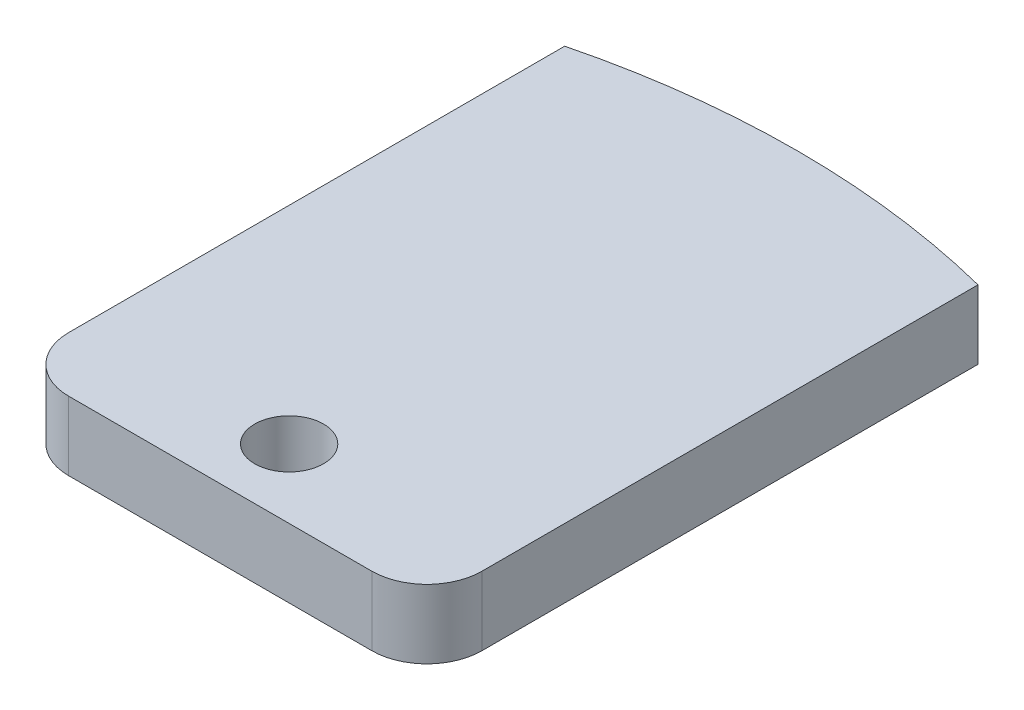
ISO-10303-21;
HEADER;
FILE_DESCRIPTION(('STEP AP214'),'2;1');
FILE_NAME('part.step','',(''),(''),'','','');
FILE_SCHEMA(('AUTOMOTIVE_DESIGN { 1 0 10303 214 1 1 1 1 }'));
ENDSEC;
DATA;
#1=APPLICATION_CONTEXT('core data for automotive mechanical design processes');
#2=APPLICATION_PROTOCOL_DEFINITION('international standard','automotive_design',2000,#1);
#3=PRODUCT_CONTEXT('',#1,'mechanical');
#4=PRODUCT('Part','Part','',(#3));
#5=PRODUCT_RELATED_PRODUCT_CATEGORY('part','',(#4));
#6=PRODUCT_DEFINITION_FORMATION('','',#4);
#7=PRODUCT_DEFINITION_CONTEXT('part definition',#1,'design');
#8=PRODUCT_DEFINITION('design','',#6,#7);
#9=PRODUCT_DEFINITION_SHAPE('','',#8);
#10=(LENGTH_UNIT() NAMED_UNIT(*) SI_UNIT(.MILLI.,.METRE.));
#11=(NAMED_UNIT(*) PLANE_ANGLE_UNIT() SI_UNIT($,.RADIAN.));
#12=(NAMED_UNIT(*) SI_UNIT($,.STERADIAN.) SOLID_ANGLE_UNIT());
#13=UNCERTAINTY_MEASURE_WITH_UNIT(LENGTH_MEASURE(1.E-05),#10,'distance_accuracy_value','');
#14=(GEOMETRIC_REPRESENTATION_CONTEXT(3) GLOBAL_UNCERTAINTY_ASSIGNED_CONTEXT((#13)) GLOBAL_UNIT_ASSIGNED_CONTEXT((#10,
#11,#12)) REPRESENTATION_CONTEXT('',''));
#15=CARTESIAN_POINT('',(0.,0.,0.));
#16=DIRECTION('',(0.,0.,1.));
#17=DIRECTION('',(1.,0.,0.));
#18=AXIS2_PLACEMENT_3D('',#15,#16,#17);
#19=CARTESIAN_POINT('',(-13.97,3.175,20.32));
#20=DIRECTION('',(0.,-1.,0.));
#21=DIRECTION('',(0.,0.,-1.));
#22=AXIS2_PLACEMENT_3D('',#19,#20,#21);
#23=CYLINDRICAL_SURFACE('',#22,5.08);
#24=CARTESIAN_POINT('',(-13.97,-3.175,20.32));
#25=DIRECTION('',(0.,1.,0.));
#26=DIRECTION('',(0.,0.,1.));
#27=AXIS2_PLACEMENT_3D('',#24,#25,#26);
#28=CIRCLE('',#27,5.08);
#29=CARTESIAN_POINT('',(-13.97,-3.175,25.4));
#30=VERTEX_POINT('',#29);
#31=CARTESIAN_POINT('',(-19.05,-3.175,20.32));
#32=VERTEX_POINT('',#31);
#33=EDGE_CURVE('E143',#30,#32,#28,.F.);
#34=ORIENTED_EDGE('',*,*,#33,.F.);
#35=DIRECTION('',(0.,-1.,0.));
#36=VECTOR('',#35,1.);
#37=CARTESIAN_POINT('',(-13.97,3.175,25.4));
#38=LINE('',#37,#36);
#39=CARTESIAN_POINT('',(-13.97,3.175,25.4));
#40=VERTEX_POINT('',#39);
#41=EDGE_CURVE('E11',#40,#30,#38,.T.);
#42=ORIENTED_EDGE('',*,*,#41,.F.);
#43=CARTESIAN_POINT('',(-13.97,3.175,20.32));
#44=DIRECTION('',(0.,1.,0.));
#45=DIRECTION('',(0.,0.,1.));
#46=AXIS2_PLACEMENT_3D('',#43,#44,#45);
#47=CIRCLE('',#46,5.08);
#48=CARTESIAN_POINT('',(-19.05,3.175,20.32));
#49=VERTEX_POINT('',#48);
#50=EDGE_CURVE('E198',#40,#49,#47,.F.);
#51=ORIENTED_EDGE('',*,*,#50,.T.);
#52=DIRECTION('',(0.,-1.,0.));
#53=VECTOR('',#52,1.);
#54=CARTESIAN_POINT('',(-19.05,3.175,20.32));
#55=LINE('',#54,#53);
#56=EDGE_CURVE('E59',#49,#32,#55,.T.);
#57=ORIENTED_EDGE('',*,*,#56,.T.);
#58=EDGE_LOOP('',(#34,#42,#51,#57));
#59=FACE_BOUND('',#58,.T.);
#60=ADVANCED_FACE('F41',(#59),#23,.T.);
#61=CARTESIAN_POINT('',(0.,3.175,25.4));
#62=DIRECTION('',(0.,0.,-1.));
#63=DIRECTION('',(-1.,0.,0.));
#64=AXIS2_PLACEMENT_3D('',#61,#62,#63);
#65=PLANE('',#64);
#66=DIRECTION('',(1.,0.,0.));
#67=VECTOR('',#66,1.);
#68=CARTESIAN_POINT('',(0.,-3.175,25.4));
#69=LINE('',#68,#67);
#70=CARTESIAN_POINT('',(13.97,-3.175,25.4));
#71=VERTEX_POINT('',#70);
#72=EDGE_CURVE('E139',#30,#71,#69,.T.);
#73=ORIENTED_EDGE('',*,*,#72,.T.);
#74=DIRECTION('',(0.,-1.,0.));
#75=VECTOR('',#74,1.);
#76=CARTESIAN_POINT('',(13.97,3.175,25.4));
#77=LINE('',#76,#75);
#78=CARTESIAN_POINT('',(13.97,3.175,25.4));
#79=VERTEX_POINT('',#78);
#80=EDGE_CURVE('E51',#79,#71,#77,.T.);
#81=ORIENTED_EDGE('',*,*,#80,.F.);
#82=DIRECTION('',(1.,0.,0.));
#83=VECTOR('',#82,1.);
#84=CARTESIAN_POINT('',(0.,3.175,25.4));
#85=LINE('',#84,#83);
#86=EDGE_CURVE('E201',#40,#79,#85,.T.);
#87=ORIENTED_EDGE('',*,*,#86,.F.);
#88=ORIENTED_EDGE('',*,*,#41,.T.);
#89=EDGE_LOOP('',(#73,#81,#87,#88));
#90=FACE_BOUND('',#89,.T.);
#91=ADVANCED_FACE('F140',(#90),#65,.F.);
#92=CARTESIAN_POINT('',(13.97,3.175,20.32));
#93=DIRECTION('',(0.,-1.,0.));
#94=DIRECTION('',(0.,0.,-1.));
#95=AXIS2_PLACEMENT_3D('',#92,#93,#94);
#96=CYLINDRICAL_SURFACE('',#95,5.08);
#97=CARTESIAN_POINT('',(13.97,-3.175,20.32));
#98=DIRECTION('',(0.,1.,0.));
#99=DIRECTION('',(0.,0.,1.));
#100=AXIS2_PLACEMENT_3D('',#97,#98,#99);
#101=CIRCLE('',#100,5.08);
#102=CARTESIAN_POINT('',(19.05,-3.175,20.32));
#103=VERTEX_POINT('',#102);
#104=EDGE_CURVE('E136',#71,#103,#101,.T.);
#105=ORIENTED_EDGE('',*,*,#104,.T.);
#106=DIRECTION('',(0.,-1.,0.));
#107=VECTOR('',#106,1.);
#108=CARTESIAN_POINT('',(19.05,3.175,20.32));
#109=LINE('',#108,#107);
#110=CARTESIAN_POINT('',(19.05,3.175,20.32));
#111=VERTEX_POINT('',#110);
#112=EDGE_CURVE('E122',#111,#103,#109,.T.);
#113=ORIENTED_EDGE('',*,*,#112,.F.);
#114=CARTESIAN_POINT('',(13.97,3.175,20.32));
#115=DIRECTION('',(0.,1.,0.));
#116=DIRECTION('',(0.,0.,1.));
#117=AXIS2_PLACEMENT_3D('',#114,#115,#116);
#118=CIRCLE('',#117,5.08);
#119=EDGE_CURVE('E113',#79,#111,#118,.T.);
#120=ORIENTED_EDGE('',*,*,#119,.F.);
#121=ORIENTED_EDGE('',*,*,#80,.T.);
#122=EDGE_LOOP('',(#105,#113,#120,#121));
#123=FACE_BOUND('',#122,.T.);
#124=ADVANCED_FACE('F135',(#123),#96,.T.);
#125=CARTESIAN_POINT('',(19.05,3.175,0.));
#126=DIRECTION('',(-1.,0.,0.));
#127=DIRECTION('',(0.,0.,1.));
#128=AXIS2_PLACEMENT_3D('',#125,#126,#127);
#129=PLANE('',#128);
#130=DIRECTION('',(0.,0.,-1.));
#131=VECTOR('',#130,1.);
#132=CARTESIAN_POINT('',(19.05,-3.175,0.));
#133=LINE('',#132,#131);
#134=CARTESIAN_POINT('',(19.05,-3.175,-25.4));
#135=VERTEX_POINT('',#134);
#136=EDGE_CURVE('E120',#103,#135,#133,.T.);
#137=ORIENTED_EDGE('',*,*,#136,.T.);
#138=DIRECTION('',(0.,-1.,0.));
#139=VECTOR('',#138,1.);
#140=CARTESIAN_POINT('',(19.05,3.175,-25.4));
#141=LINE('',#140,#139);
#142=CARTESIAN_POINT('',(19.05,3.175,-25.4));
#143=VERTEX_POINT('',#142);
#144=EDGE_CURVE('E101',#143,#135,#141,.T.);
#145=ORIENTED_EDGE('',*,*,#144,.F.);
#146=DIRECTION('',(0.,0.,-1.));
#147=VECTOR('',#146,1.);
#148=CARTESIAN_POINT('',(19.05,3.175,0.));
#149=LINE('',#148,#147);
#150=EDGE_CURVE('E107',#111,#143,#149,.T.);
#151=ORIENTED_EDGE('',*,*,#150,.F.);
#152=ORIENTED_EDGE('',*,*,#112,.T.);
#153=EDGE_LOOP('',(#137,#145,#151,#152));
#154=FACE_BOUND('',#153,.T.);
#155=ADVANCED_FACE('F119',(#154),#129,.F.);
#156=CARTESIAN_POINT('',(0.,3.175,49.8484849133855));
#157=DIRECTION('',(0.,-1.,0.));
#158=DIRECTION('',(0.,0.,-1.));
#159=AXIS2_PLACEMENT_3D('',#156,#157,#158);
#160=CYLINDRICAL_SURFACE('',#159,77.6224);
#161=CARTESIAN_POINT('',(0.,-3.175,49.8484849133855));
#162=DIRECTION('',(0.,1.,0.));
#163=DIRECTION('',(0.,0.,1.));
#164=AXIS2_PLACEMENT_3D('',#161,#162,#163);
#165=CIRCLE('',#164,77.6224);
#166=CARTESIAN_POINT('',(-19.05,-3.175,-25.4));
#167=VERTEX_POINT('',#166);
#168=EDGE_CURVE('E154',#135,#167,#165,.T.);
#169=ORIENTED_EDGE('',*,*,#168,.T.);
#170=DIRECTION('',(0.,-1.,0.));
#171=VECTOR('',#170,1.);
#172=CARTESIAN_POINT('',(-19.05,3.175,-25.4));
#173=LINE('',#172,#171);
#174=CARTESIAN_POINT('',(-19.05,3.175,-25.4));
#175=VERTEX_POINT('',#174);
#176=EDGE_CURVE('E79',#175,#167,#173,.T.);
#177=ORIENTED_EDGE('',*,*,#176,.F.);
#178=CARTESIAN_POINT('',(0.,3.175,49.8484849133855));
#179=DIRECTION('',(0.,1.,0.));
#180=DIRECTION('',(0.,0.,1.));
#181=AXIS2_PLACEMENT_3D('',#178,#179,#180);
#182=CIRCLE('',#181,77.6224);
#183=EDGE_CURVE('E97',#143,#175,#182,.T.);
#184=ORIENTED_EDGE('',*,*,#183,.F.);
#185=ORIENTED_EDGE('',*,*,#144,.T.);
#186=EDGE_LOOP('',(#169,#177,#184,#185));
#187=FACE_BOUND('',#186,.T.);
#188=ADVANCED_FACE('F99',(#187),#160,.T.);
#189=CARTESIAN_POINT('',(0.,3.175,19.05));
#190=DIRECTION('',(0.,-1.,0.));
#191=DIRECTION('',(0.,0.,-1.));
#192=AXIS2_PLACEMENT_3D('',#189,#190,#191);
#193=CYLINDRICAL_SURFACE('',#192,3.175);
#194=CARTESIAN_POINT('',(0.,3.175,19.05));
#195=DIRECTION('',(0.,1.,0.));
#196=DIRECTION('',(0.,0.,1.));
#197=AXIS2_PLACEMENT_3D('',#194,#195,#196);
#198=CIRCLE('',#197,3.175);
#199=CARTESIAN_POINT('',(0.,3.175,22.225));
#200=VERTEX_POINT('',#199);
#201=EDGE_CURVE('E160',#200,#200,#198,.T.);
#202=ORIENTED_EDGE('',*,*,#201,.T.);
#203=EDGE_LOOP('',(#202));
#204=FACE_BOUND('',#203,.T.);
#205=CARTESIAN_POINT('',(0.,-3.175,19.05));
#206=DIRECTION('',(0.,1.,0.));
#207=DIRECTION('',(0.,0.,1.));
#208=AXIS2_PLACEMENT_3D('',#205,#206,#207);
#209=CIRCLE('',#208,3.175);
#210=CARTESIAN_POINT('',(0.,-3.175,22.225));
#211=VERTEX_POINT('',#210);
#212=EDGE_CURVE('E148',#211,#211,#209,.T.);
#213=ORIENTED_EDGE('',*,*,#212,.F.);
#214=EDGE_LOOP('',(#213));
#215=FACE_BOUND('',#214,.T.);
#216=ADVANCED_FACE('F43',(#204,#215),#193,.F.);
#217=CARTESIAN_POINT('',(-19.05,3.175,0.));
#218=DIRECTION('',(-1.,0.,0.));
#219=DIRECTION('',(0.,0.,1.));
#220=AXIS2_PLACEMENT_3D('',#217,#218,#219);
#221=PLANE('',#220);
#222=DIRECTION('',(0.,0.,-1.));
#223=VECTOR('',#222,1.);
#224=CARTESIAN_POINT('',(-19.05,-3.175,0.));
#225=LINE('',#224,#223);
#226=EDGE_CURVE('E157',#32,#167,#225,.T.);
#227=ORIENTED_EDGE('',*,*,#226,.F.);
#228=ORIENTED_EDGE('',*,*,#56,.F.);
#229=DIRECTION('',(0.,0.,-1.));
#230=VECTOR('',#229,1.);
#231=CARTESIAN_POINT('',(-19.05,3.175,0.));
#232=LINE('',#231,#230);
#233=EDGE_CURVE('E106',#49,#175,#232,.T.);
#234=ORIENTED_EDGE('',*,*,#233,.T.);
#235=ORIENTED_EDGE('',*,*,#176,.T.);
#236=EDGE_LOOP('',(#227,#228,#234,#235));
#237=FACE_BOUND('',#236,.T.);
#238=ADVANCED_FACE('F171',(#237),#221,.T.);
#239=CARTESIAN_POINT('',(0.,3.175,0.));
#240=DIRECTION('',(0.,1.,0.));
#241=DIRECTION('',(0.,0.,1.));
#242=AXIS2_PLACEMENT_3D('',#239,#240,#241);
#243=PLANE('',#242);
#244=ORIENTED_EDGE('',*,*,#201,.F.);
#245=EDGE_LOOP('',(#244));
#246=FACE_BOUND('',#245,.T.);
#247=ORIENTED_EDGE('',*,*,#50,.F.);
#248=ORIENTED_EDGE('',*,*,#86,.T.);
#249=ORIENTED_EDGE('',*,*,#119,.T.);
#250=ORIENTED_EDGE('',*,*,#150,.T.);
#251=ORIENTED_EDGE('',*,*,#183,.T.);
#252=ORIENTED_EDGE('',*,*,#233,.F.);
#253=EDGE_LOOP('',(#247,#248,#249,#250,#251,#252));
#254=FACE_BOUND('',#253,.T.);
#255=ADVANCED_FACE('F111',(#246,#254),#243,.T.);
#256=CARTESIAN_POINT('',(0.,-3.175,0.));
#257=DIRECTION('',(0.,1.,0.));
#258=DIRECTION('',(0.,0.,1.));
#259=AXIS2_PLACEMENT_3D('',#256,#257,#258);
#260=PLANE('',#259);
#261=ORIENTED_EDGE('',*,*,#212,.T.);
#262=EDGE_LOOP('',(#261));
#263=FACE_BOUND('',#262,.T.);
#264=ORIENTED_EDGE('',*,*,#33,.T.);
#265=ORIENTED_EDGE('',*,*,#226,.T.);
#266=ORIENTED_EDGE('',*,*,#168,.F.);
#267=ORIENTED_EDGE('',*,*,#136,.F.);
#268=ORIENTED_EDGE('',*,*,#104,.F.);
#269=ORIENTED_EDGE('',*,*,#72,.F.);
#270=EDGE_LOOP('',(#264,#265,#266,#267,#268,#269));
#271=FACE_BOUND('',#270,.T.);
#272=ADVANCED_FACE('F168',(#263,#271),#260,.F.);
#273=CLOSED_SHELL('',(#60,#91,#124,#155,#188,#216,#238,#255,#272));
#274=MANIFOLD_SOLID_BREP('B2',#273);
#275=ADVANCED_BREP_SHAPE_REPRESENTATION('',(#18,#274),#14);
#276=SHAPE_DEFINITION_REPRESENTATION(#9,#275);
ENDSEC;
END-ISO-10303-21;
